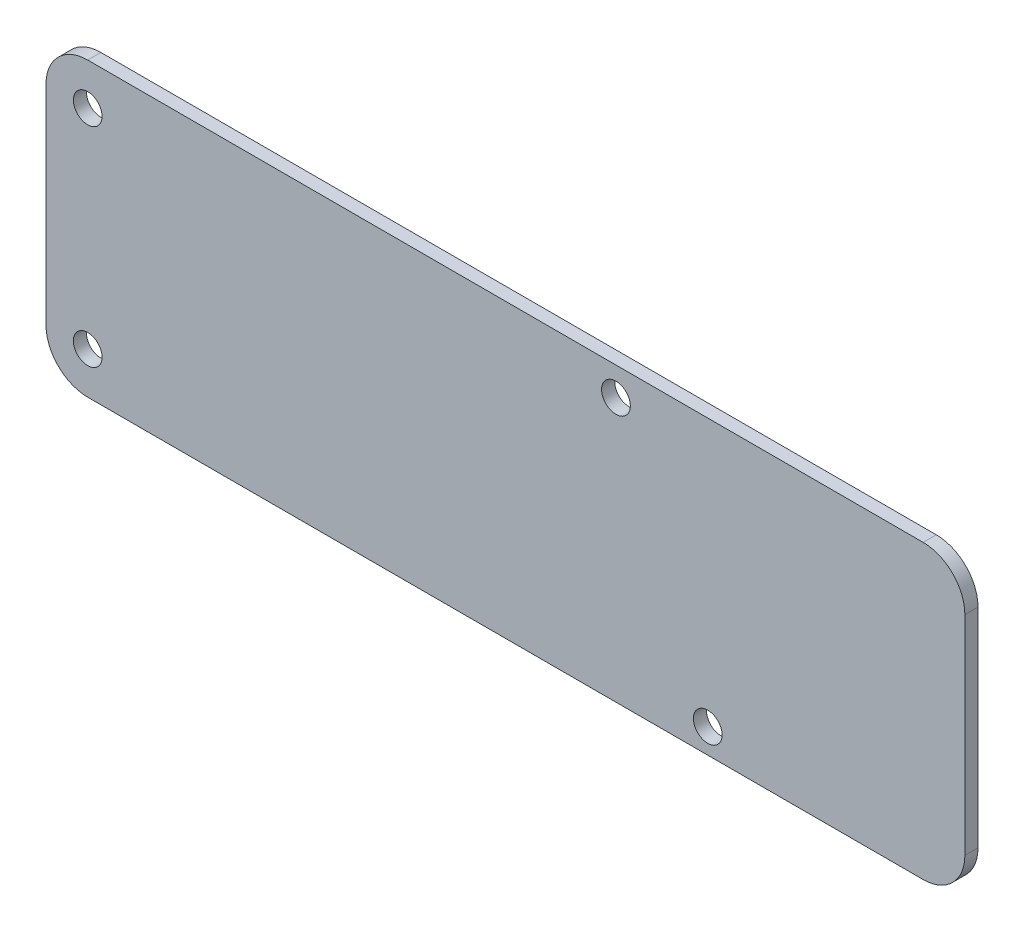
ISO-10303-21;
HEADER;
FILE_DESCRIPTION(('STEP AP214'),'2;1');
FILE_NAME('part.step','',(''),(''),'','','');
FILE_SCHEMA(('AUTOMOTIVE_DESIGN { 1 0 10303 214 1 1 1 1 }'));
ENDSEC;
DATA;
#1=APPLICATION_CONTEXT('core data for automotive mechanical design processes');
#2=APPLICATION_PROTOCOL_DEFINITION('international standard','automotive_design',2000,#1);
#3=PRODUCT_CONTEXT('',#1,'mechanical');
#4=PRODUCT('Part','Part','',(#3));
#5=PRODUCT_RELATED_PRODUCT_CATEGORY('part','',(#4));
#6=PRODUCT_DEFINITION_FORMATION('','',#4);
#7=PRODUCT_DEFINITION_CONTEXT('part definition',#1,'design');
#8=PRODUCT_DEFINITION('design','',#6,#7);
#9=PRODUCT_DEFINITION_SHAPE('','',#8);
#10=(LENGTH_UNIT() NAMED_UNIT(*) SI_UNIT(.MILLI.,.METRE.));
#11=(NAMED_UNIT(*) PLANE_ANGLE_UNIT() SI_UNIT($,.RADIAN.));
#12=(NAMED_UNIT(*) SI_UNIT($,.STERADIAN.) SOLID_ANGLE_UNIT());
#13=UNCERTAINTY_MEASURE_WITH_UNIT(LENGTH_MEASURE(1.E-05),#10,'distance_accuracy_value','');
#14=(GEOMETRIC_REPRESENTATION_CONTEXT(3) GLOBAL_UNCERTAINTY_ASSIGNED_CONTEXT((#13)) GLOBAL_UNIT_ASSIGNED_CONTEXT((#10,
#11,#12)) REPRESENTATION_CONTEXT('',''));
#15=CARTESIAN_POINT('',(0.,0.,0.));
#16=DIRECTION('',(0.,0.,1.));
#17=DIRECTION('',(1.,0.,0.));
#18=AXIS2_PLACEMENT_3D('',#15,#16,#17);
#19=CARTESIAN_POINT('',(0.,-25.4,1.6));
#20=DIRECTION('',(0.,0.,1.));
#21=DIRECTION('',(1.,0.,0.));
#22=AXIS2_PLACEMENT_3D('',#19,#20,#21);
#23=PLANE('',#22);
#24=CARTESIAN_POINT('',(64.33,1.63,1.6));
#25=DIRECTION('',(0.,0.,1.));
#26=DIRECTION('',(1.,0.,0.));
#27=AXIS2_PLACEMENT_3D('',#24,#25,#26);
#28=CIRCLE('',#27,1.75);
#29=CARTESIAN_POINT('',(66.08,1.63,1.6));
#30=VERTEX_POINT('',#29);
#31=EDGE_CURVE('E194',#30,#30,#28,.T.);
#32=ORIENTED_EDGE('',*,*,#31,.F.);
#33=EDGE_LOOP('',(#32));
#34=FACE_BOUND('',#33,.T.);
#35=CARTESIAN_POINT('',(0.,0.,1.6));
#36=DIRECTION('',(0.,0.,1.));
#37=DIRECTION('',(1.,0.,0.));
#38=AXIS2_PLACEMENT_3D('',#35,#36,#37);
#39=CIRCLE('',#38,1.75);
#40=CARTESIAN_POINT('',(1.75,0.,1.6));
#41=VERTEX_POINT('',#40);
#42=EDGE_CURVE('E140',#41,#41,#39,.T.);
#43=ORIENTED_EDGE('',*,*,#42,.F.);
#44=EDGE_LOOP('',(#43));
#45=FACE_BOUND('',#44,.T.);
#46=CARTESIAN_POINT('',(0.,-25.4,1.6));
#47=DIRECTION('',(0.,0.,1.));
#48=DIRECTION('',(1.,0.,0.));
#49=AXIS2_PLACEMENT_3D('',#46,#47,#48);
#50=CIRCLE('',#49,5.08);
#51=CARTESIAN_POINT('',(-5.08,-25.4,1.6));
#52=VERTEX_POINT('',#51);
#53=CARTESIAN_POINT('',(0.,-30.48,1.6));
#54=VERTEX_POINT('',#53);
#55=EDGE_CURVE('E151',#52,#54,#50,.T.);
#56=ORIENTED_EDGE('',*,*,#55,.T.);
#57=DIRECTION('',(1.,0.,0.));
#58=VECTOR('',#57,1.);
#59=CARTESIAN_POINT('',(0.,-30.48,1.6));
#60=LINE('',#59,#58);
#61=CARTESIAN_POINT('',(101.74,-30.48,1.6));
#62=VERTEX_POINT('',#61);
#63=EDGE_CURVE('E99',#54,#62,#60,.T.);
#64=ORIENTED_EDGE('',*,*,#63,.T.);
#65=CARTESIAN_POINT('',(101.74,-25.4,1.6));
#66=DIRECTION('',(0.,0.,1.));
#67=DIRECTION('',(1.,0.,0.));
#68=AXIS2_PLACEMENT_3D('',#65,#66,#67);
#69=CIRCLE('',#68,5.08);
#70=CARTESIAN_POINT('',(106.82,-25.4,1.6));
#71=VERTEX_POINT('',#70);
#72=EDGE_CURVE('E166',#62,#71,#69,.T.);
#73=ORIENTED_EDGE('',*,*,#72,.T.);
#74=DIRECTION('',(0.,1.,0.));
#75=VECTOR('',#74,1.);
#76=CARTESIAN_POINT('',(106.82,0.,1.6));
#77=LINE('',#76,#75);
#78=CARTESIAN_POINT('',(106.82,0.,1.6));
#79=VERTEX_POINT('',#78);
#80=EDGE_CURVE('E179',#71,#79,#77,.T.);
#81=ORIENTED_EDGE('',*,*,#80,.T.);
#82=CARTESIAN_POINT('',(101.74,0.,1.6));
#83=DIRECTION('',(0.,0.,1.));
#84=DIRECTION('',(-1.,0.,0.));
#85=AXIS2_PLACEMENT_3D('',#82,#83,#84);
#86=CIRCLE('',#85,5.08);
#87=CARTESIAN_POINT('',(101.74,5.08,1.6));
#88=VERTEX_POINT('',#87);
#89=EDGE_CURVE('E118',#79,#88,#86,.T.);
#90=ORIENTED_EDGE('',*,*,#89,.T.);
#91=DIRECTION('',(-1.,0.,0.));
#92=VECTOR('',#91,1.);
#93=CARTESIAN_POINT('',(0.,5.08,1.6));
#94=LINE('',#93,#92);
#95=CARTESIAN_POINT('',(0.,5.08,1.6));
#96=VERTEX_POINT('',#95);
#97=EDGE_CURVE('E112',#88,#96,#94,.T.);
#98=ORIENTED_EDGE('',*,*,#97,.T.);
#99=CARTESIAN_POINT('',(0.,0.,1.6));
#100=DIRECTION('',(0.,0.,1.));
#101=DIRECTION('',(1.,0.,0.));
#102=AXIS2_PLACEMENT_3D('',#99,#100,#101);
#103=CIRCLE('',#102,5.08);
#104=CARTESIAN_POINT('',(-5.08,0.,1.6));
#105=VERTEX_POINT('',#104);
#106=EDGE_CURVE('E116',#96,#105,#103,.T.);
#107=ORIENTED_EDGE('',*,*,#106,.T.);
#108=DIRECTION('',(0.,-1.,0.));
#109=VECTOR('',#108,1.);
#110=CARTESIAN_POINT('',(-5.08,0.,1.6));
#111=LINE('',#110,#109);
#112=EDGE_CURVE('E56',#105,#52,#111,.T.);
#113=ORIENTED_EDGE('',*,*,#112,.T.);
#114=EDGE_LOOP('',(#56,#64,#73,#81,#90,#98,#107,#113));
#115=FACE_BOUND('',#114,.T.);
#116=CARTESIAN_POINT('',(0.,-25.4,1.6));
#117=DIRECTION('',(0.,0.,1.));
#118=DIRECTION('',(1.,0.,0.));
#119=AXIS2_PLACEMENT_3D('',#116,#117,#118);
#120=CIRCLE('',#119,1.75);
#121=CARTESIAN_POINT('',(1.75,-25.4,1.6));
#122=VERTEX_POINT('',#121);
#123=EDGE_CURVE('E188',#122,#122,#120,.T.);
#124=ORIENTED_EDGE('',*,*,#123,.F.);
#125=EDGE_LOOP('',(#124));
#126=FACE_BOUND('',#125,.T.);
#127=CARTESIAN_POINT('',(75.51,-27.48,1.6));
#128=DIRECTION('',(0.,0.,1.));
#129=DIRECTION('',(1.,0.,0.));
#130=AXIS2_PLACEMENT_3D('',#127,#128,#129);
#131=CIRCLE('',#130,1.75);
#132=CARTESIAN_POINT('',(77.26,-27.48,1.6));
#133=VERTEX_POINT('',#132);
#134=EDGE_CURVE('E200',#133,#133,#131,.T.);
#135=ORIENTED_EDGE('',*,*,#134,.F.);
#136=EDGE_LOOP('',(#135));
#137=FACE_BOUND('',#136,.T.);
#138=ADVANCED_FACE('F39',(#34,#45,#115,#126,#137),#23,.T.);
#139=CARTESIAN_POINT('',(0.,-25.4,0.));
#140=DIRECTION('',(0.,0.,1.));
#141=DIRECTION('',(1.,0.,0.));
#142=AXIS2_PLACEMENT_3D('',#139,#140,#141);
#143=PLANE('',#142);
#144=CARTESIAN_POINT('',(0.,-25.4,0.));
#145=DIRECTION('',(0.,0.,1.));
#146=DIRECTION('',(1.,0.,0.));
#147=AXIS2_PLACEMENT_3D('',#144,#145,#146);
#148=CIRCLE('',#147,5.08);
#149=CARTESIAN_POINT('',(-5.08,-25.4,0.));
#150=VERTEX_POINT('',#149);
#151=CARTESIAN_POINT('',(0.,-30.48,0.));
#152=VERTEX_POINT('',#151);
#153=EDGE_CURVE('E136',#150,#152,#148,.T.);
#154=ORIENTED_EDGE('',*,*,#153,.F.);
#155=DIRECTION('',(0.,-1.,0.));
#156=VECTOR('',#155,1.);
#157=CARTESIAN_POINT('',(-5.08,0.,0.));
#158=LINE('',#157,#156);
#159=CARTESIAN_POINT('',(-5.08,0.,0.));
#160=VERTEX_POINT('',#159);
#161=EDGE_CURVE('E91',#160,#150,#158,.T.);
#162=ORIENTED_EDGE('',*,*,#161,.F.);
#163=CARTESIAN_POINT('',(0.,0.,0.));
#164=DIRECTION('',(0.,0.,1.));
#165=DIRECTION('',(1.,0.,0.));
#166=AXIS2_PLACEMENT_3D('',#163,#164,#165);
#167=CIRCLE('',#166,5.08);
#168=CARTESIAN_POINT('',(0.,5.08,0.));
#169=VERTEX_POINT('',#168);
#170=EDGE_CURVE('E85',#169,#160,#167,.T.);
#171=ORIENTED_EDGE('',*,*,#170,.F.);
#172=DIRECTION('',(-1.,0.,0.));
#173=VECTOR('',#172,1.);
#174=CARTESIAN_POINT('',(0.,5.08,0.));
#175=LINE('',#174,#173);
#176=CARTESIAN_POINT('',(101.74,5.08,0.));
#177=VERTEX_POINT('',#176);
#178=EDGE_CURVE('E126',#177,#169,#175,.T.);
#179=ORIENTED_EDGE('',*,*,#178,.F.);
#180=CARTESIAN_POINT('',(101.74,0.,0.));
#181=DIRECTION('',(0.,0.,1.));
#182=DIRECTION('',(-1.,0.,0.));
#183=AXIS2_PLACEMENT_3D('',#180,#181,#182);
#184=CIRCLE('',#183,5.08);
#185=CARTESIAN_POINT('',(106.82,0.,0.));
#186=VERTEX_POINT('',#185);
#187=EDGE_CURVE('E146',#186,#177,#184,.T.);
#188=ORIENTED_EDGE('',*,*,#187,.F.);
#189=DIRECTION('',(0.,1.,0.));
#190=VECTOR('',#189,1.);
#191=CARTESIAN_POINT('',(106.82,0.,0.));
#192=LINE('',#191,#190);
#193=CARTESIAN_POINT('',(106.82,-25.4,0.));
#194=VERTEX_POINT('',#193);
#195=EDGE_CURVE('E144',#194,#186,#192,.T.);
#196=ORIENTED_EDGE('',*,*,#195,.F.);
#197=CARTESIAN_POINT('',(101.74,-25.4,0.));
#198=DIRECTION('',(0.,0.,1.));
#199=DIRECTION('',(1.,0.,0.));
#200=AXIS2_PLACEMENT_3D('',#197,#198,#199);
#201=CIRCLE('',#200,5.08);
#202=CARTESIAN_POINT('',(101.74,-30.48,0.));
#203=VERTEX_POINT('',#202);
#204=EDGE_CURVE('E142',#203,#194,#201,.T.);
#205=ORIENTED_EDGE('',*,*,#204,.F.);
#206=DIRECTION('',(1.,0.,0.));
#207=VECTOR('',#206,1.);
#208=CARTESIAN_POINT('',(0.,-30.48,0.));
#209=LINE('',#208,#207);
#210=EDGE_CURVE('E139',#152,#203,#209,.T.);
#211=ORIENTED_EDGE('',*,*,#210,.F.);
#212=EDGE_LOOP('',(#154,#162,#171,#179,#188,#196,#205,#211));
#213=FACE_BOUND('',#212,.T.);
#214=CARTESIAN_POINT('',(0.,0.,0.));
#215=DIRECTION('',(0.,0.,1.));
#216=DIRECTION('',(1.,0.,0.));
#217=AXIS2_PLACEMENT_3D('',#214,#215,#216);
#218=CIRCLE('',#217,1.75);
#219=CARTESIAN_POINT('',(1.75,0.,0.));
#220=VERTEX_POINT('',#219);
#221=EDGE_CURVE('E185',#220,#220,#218,.T.);
#222=ORIENTED_EDGE('',*,*,#221,.T.);
#223=EDGE_LOOP('',(#222));
#224=FACE_BOUND('',#223,.T.);
#225=CARTESIAN_POINT('',(0.,-25.4,0.));
#226=DIRECTION('',(0.,0.,1.));
#227=DIRECTION('',(1.,0.,0.));
#228=AXIS2_PLACEMENT_3D('',#225,#226,#227);
#229=CIRCLE('',#228,1.75);
#230=CARTESIAN_POINT('',(1.75,-25.4,0.));
#231=VERTEX_POINT('',#230);
#232=EDGE_CURVE('E191',#231,#231,#229,.T.);
#233=ORIENTED_EDGE('',*,*,#232,.T.);
#234=EDGE_LOOP('',(#233));
#235=FACE_BOUND('',#234,.T.);
#236=CARTESIAN_POINT('',(64.33,1.63,0.));
#237=DIRECTION('',(0.,0.,1.));
#238=DIRECTION('',(1.,0.,0.));
#239=AXIS2_PLACEMENT_3D('',#236,#237,#238);
#240=CIRCLE('',#239,1.75);
#241=CARTESIAN_POINT('',(66.08,1.63,0.));
#242=VERTEX_POINT('',#241);
#243=EDGE_CURVE('E197',#242,#242,#240,.T.);
#244=ORIENTED_EDGE('',*,*,#243,.T.);
#245=EDGE_LOOP('',(#244));
#246=FACE_BOUND('',#245,.T.);
#247=CARTESIAN_POINT('',(75.51,-27.48,0.));
#248=DIRECTION('',(0.,0.,1.));
#249=DIRECTION('',(1.,0.,0.));
#250=AXIS2_PLACEMENT_3D('',#247,#248,#249);
#251=CIRCLE('',#250,1.75);
#252=CARTESIAN_POINT('',(77.26,-27.48,0.));
#253=VERTEX_POINT('',#252);
#254=EDGE_CURVE('E203',#253,#253,#251,.T.);
#255=ORIENTED_EDGE('',*,*,#254,.T.);
#256=EDGE_LOOP('',(#255));
#257=FACE_BOUND('',#256,.T.);
#258=ADVANCED_FACE('F170',(#213,#224,#235,#246,#257),#143,.F.);
#259=CARTESIAN_POINT('',(0.,-25.4,1.6));
#260=DIRECTION('',(0.,0.,-1.));
#261=DIRECTION('',(-1.,0.,0.));
#262=AXIS2_PLACEMENT_3D('',#259,#260,#261);
#263=CYLINDRICAL_SURFACE('',#262,5.08);
#264=ORIENTED_EDGE('',*,*,#153,.T.);
#265=DIRECTION('',(0.,0.,-1.));
#266=VECTOR('',#265,1.);
#267=CARTESIAN_POINT('',(0.,-30.48,1.6));
#268=LINE('',#267,#266);
#269=EDGE_CURVE('E11',#54,#152,#268,.T.);
#270=ORIENTED_EDGE('',*,*,#269,.F.);
#271=ORIENTED_EDGE('',*,*,#55,.F.);
#272=DIRECTION('',(0.,0.,-1.));
#273=VECTOR('',#272,1.);
#274=CARTESIAN_POINT('',(-5.08,-25.4,1.6));
#275=LINE('',#274,#273);
#276=EDGE_CURVE('E132',#52,#150,#275,.T.);
#277=ORIENTED_EDGE('',*,*,#276,.T.);
#278=EDGE_LOOP('',(#264,#270,#271,#277));
#279=FACE_BOUND('',#278,.T.);
#280=ADVANCED_FACE('F41',(#279),#263,.T.);
#281=CARTESIAN_POINT('',(0.,-30.48,1.6));
#282=DIRECTION('',(0.,1.,0.));
#283=DIRECTION('',(0.,0.,1.));
#284=AXIS2_PLACEMENT_3D('',#281,#282,#283);
#285=PLANE('',#284);
#286=ORIENTED_EDGE('',*,*,#210,.T.);
#287=DIRECTION('',(0.,0.,-1.));
#288=VECTOR('',#287,1.);
#289=CARTESIAN_POINT('',(101.74,-30.48,1.6));
#290=LINE('',#289,#288);
#291=EDGE_CURVE('E48',#62,#203,#290,.T.);
#292=ORIENTED_EDGE('',*,*,#291,.F.);
#293=ORIENTED_EDGE('',*,*,#63,.F.);
#294=ORIENTED_EDGE('',*,*,#269,.T.);
#295=EDGE_LOOP('',(#286,#292,#293,#294));
#296=FACE_BOUND('',#295,.T.);
#297=ADVANCED_FACE('F237',(#296),#285,.F.);
#298=CARTESIAN_POINT('',(101.74,-25.4,1.6));
#299=DIRECTION('',(0.,0.,-1.));
#300=DIRECTION('',(-1.,0.,0.));
#301=AXIS2_PLACEMENT_3D('',#298,#299,#300);
#302=CYLINDRICAL_SURFACE('',#301,5.08);
#303=ORIENTED_EDGE('',*,*,#204,.T.);
#304=DIRECTION('',(0.,0.,-1.));
#305=VECTOR('',#304,1.);
#306=CARTESIAN_POINT('',(106.82,-25.4,1.6));
#307=LINE('',#306,#305);
#308=EDGE_CURVE('E158',#71,#194,#307,.T.);
#309=ORIENTED_EDGE('',*,*,#308,.F.);
#310=ORIENTED_EDGE('',*,*,#72,.F.);
#311=ORIENTED_EDGE('',*,*,#291,.T.);
#312=EDGE_LOOP('',(#303,#309,#310,#311));
#313=FACE_BOUND('',#312,.T.);
#314=ADVANCED_FACE('F164',(#313),#302,.T.);
#315=CARTESIAN_POINT('',(106.82,0.,1.6));
#316=DIRECTION('',(-1.,0.,0.));
#317=DIRECTION('',(0.,0.,1.));
#318=AXIS2_PLACEMENT_3D('',#315,#316,#317);
#319=PLANE('',#318);
#320=ORIENTED_EDGE('',*,*,#195,.T.);
#321=DIRECTION('',(0.,0.,-1.));
#322=VECTOR('',#321,1.);
#323=CARTESIAN_POINT('',(106.82,0.,1.6));
#324=LINE('',#323,#322);
#325=EDGE_CURVE('E155',#79,#186,#324,.T.);
#326=ORIENTED_EDGE('',*,*,#325,.F.);
#327=ORIENTED_EDGE('',*,*,#80,.F.);
#328=ORIENTED_EDGE('',*,*,#308,.T.);
#329=EDGE_LOOP('',(#320,#326,#327,#328));
#330=FACE_BOUND('',#329,.T.);
#331=ADVANCED_FACE('F175',(#330),#319,.F.);
#332=CARTESIAN_POINT('',(101.74,0.,1.6));
#333=DIRECTION('',(0.,0.,-1.));
#334=DIRECTION('',(-1.,0.,0.));
#335=AXIS2_PLACEMENT_3D('',#332,#333,#334);
#336=CYLINDRICAL_SURFACE('',#335,5.08);
#337=ORIENTED_EDGE('',*,*,#187,.T.);
#338=DIRECTION('',(0.,0.,-1.));
#339=VECTOR('',#338,1.);
#340=CARTESIAN_POINT('',(101.74,5.08,1.6));
#341=LINE('',#340,#339);
#342=EDGE_CURVE('E127',#88,#177,#341,.T.);
#343=ORIENTED_EDGE('',*,*,#342,.F.);
#344=ORIENTED_EDGE('',*,*,#89,.F.);
#345=ORIENTED_EDGE('',*,*,#325,.T.);
#346=EDGE_LOOP('',(#337,#343,#344,#345));
#347=FACE_BOUND('',#346,.T.);
#348=ADVANCED_FACE('F178',(#347),#336,.T.);
#349=CARTESIAN_POINT('',(0.,5.08,1.6));
#350=DIRECTION('',(0.,-1.,0.));
#351=DIRECTION('',(0.,0.,-1.));
#352=AXIS2_PLACEMENT_3D('',#349,#350,#351);
#353=PLANE('',#352);
#354=ORIENTED_EDGE('',*,*,#178,.T.);
#355=DIRECTION('',(0.,0.,-1.));
#356=VECTOR('',#355,1.);
#357=CARTESIAN_POINT('',(0.,5.08,1.6));
#358=LINE('',#357,#356);
#359=EDGE_CURVE('E123',#96,#169,#358,.T.);
#360=ORIENTED_EDGE('',*,*,#359,.F.);
#361=ORIENTED_EDGE('',*,*,#97,.F.);
#362=ORIENTED_EDGE('',*,*,#342,.T.);
#363=EDGE_LOOP('',(#354,#360,#361,#362));
#364=FACE_BOUND('',#363,.T.);
#365=ADVANCED_FACE('F124',(#364),#353,.F.);
#366=CARTESIAN_POINT('',(0.,0.,1.6));
#367=DIRECTION('',(0.,0.,-1.));
#368=DIRECTION('',(-1.,0.,0.));
#369=AXIS2_PLACEMENT_3D('',#366,#367,#368);
#370=CYLINDRICAL_SURFACE('',#369,5.08);
#371=ORIENTED_EDGE('',*,*,#170,.T.);
#372=DIRECTION('',(0.,0.,-1.));
#373=VECTOR('',#372,1.);
#374=CARTESIAN_POINT('',(-5.08,0.,1.6));
#375=LINE('',#374,#373);
#376=EDGE_CURVE('E128',#105,#160,#375,.T.);
#377=ORIENTED_EDGE('',*,*,#376,.F.);
#378=ORIENTED_EDGE('',*,*,#106,.F.);
#379=ORIENTED_EDGE('',*,*,#359,.T.);
#380=EDGE_LOOP('',(#371,#377,#378,#379));
#381=FACE_BOUND('',#380,.T.);
#382=ADVANCED_FACE('F130',(#381),#370,.T.);
#383=CARTESIAN_POINT('',(-5.08,0.,1.6));
#384=DIRECTION('',(1.,0.,0.));
#385=DIRECTION('',(0.,1.,0.));
#386=AXIS2_PLACEMENT_3D('',#383,#384,#385);
#387=PLANE('',#386);
#388=ORIENTED_EDGE('',*,*,#161,.T.);
#389=ORIENTED_EDGE('',*,*,#276,.F.);
#390=ORIENTED_EDGE('',*,*,#112,.F.);
#391=ORIENTED_EDGE('',*,*,#376,.T.);
#392=EDGE_LOOP('',(#388,#389,#390,#391));
#393=FACE_BOUND('',#392,.T.);
#394=ADVANCED_FACE('F225',(#393),#387,.F.);
#395=CARTESIAN_POINT('',(0.,0.,1.6));
#396=DIRECTION('',(0.,0.,-1.));
#397=DIRECTION('',(-1.,0.,0.));
#398=AXIS2_PLACEMENT_3D('',#395,#396,#397);
#399=CYLINDRICAL_SURFACE('',#398,1.75);
#400=ORIENTED_EDGE('',*,*,#42,.T.);
#401=EDGE_LOOP('',(#400));
#402=FACE_BOUND('',#401,.T.);
#403=ORIENTED_EDGE('',*,*,#221,.F.);
#404=EDGE_LOOP('',(#403));
#405=FACE_BOUND('',#404,.T.);
#406=ADVANCED_FACE('F222',(#402,#405),#399,.F.);
#407=CARTESIAN_POINT('',(0.,-25.4,1.6));
#408=DIRECTION('',(0.,0.,-1.));
#409=DIRECTION('',(-1.,0.,0.));
#410=AXIS2_PLACEMENT_3D('',#407,#408,#409);
#411=CYLINDRICAL_SURFACE('',#410,1.75);
#412=ORIENTED_EDGE('',*,*,#123,.T.);
#413=EDGE_LOOP('',(#412));
#414=FACE_BOUND('',#413,.T.);
#415=ORIENTED_EDGE('',*,*,#232,.F.);
#416=EDGE_LOOP('',(#415));
#417=FACE_BOUND('',#416,.T.);
#418=ADVANCED_FACE('F300',(#414,#417),#411,.F.);
#419=CARTESIAN_POINT('',(64.33,1.63,1.6));
#420=DIRECTION('',(0.,0.,-1.));
#421=DIRECTION('',(-1.,0.,0.));
#422=AXIS2_PLACEMENT_3D('',#419,#420,#421);
#423=CYLINDRICAL_SURFACE('',#422,1.75);
#424=ORIENTED_EDGE('',*,*,#31,.T.);
#425=EDGE_LOOP('',(#424));
#426=FACE_BOUND('',#425,.T.);
#427=ORIENTED_EDGE('',*,*,#243,.F.);
#428=EDGE_LOOP('',(#427));
#429=FACE_BOUND('',#428,.T.);
#430=ADVANCED_FACE('F308',(#426,#429),#423,.F.);
#431=CARTESIAN_POINT('',(75.51,-27.48,1.6));
#432=DIRECTION('',(0.,0.,-1.));
#433=DIRECTION('',(-1.,0.,0.));
#434=AXIS2_PLACEMENT_3D('',#431,#432,#433);
#435=CYLINDRICAL_SURFACE('',#434,1.75);
#436=ORIENTED_EDGE('',*,*,#134,.T.);
#437=EDGE_LOOP('',(#436));
#438=FACE_BOUND('',#437,.T.);
#439=ORIENTED_EDGE('',*,*,#254,.F.);
#440=EDGE_LOOP('',(#439));
#441=FACE_BOUND('',#440,.T.);
#442=ADVANCED_FACE('F209',(#438,#441),#435,.F.);
#443=CLOSED_SHELL('',(#138,#258,#280,#297,#314,#331,#348,#365,#382,#394,#406,#418,#430,#442));
#444=MANIFOLD_SOLID_BREP('B2',#443);
#445=ADVANCED_BREP_SHAPE_REPRESENTATION('',(#18,#444),#14);
#446=SHAPE_DEFINITION_REPRESENTATION(#9,#445);
ENDSEC;
END-ISO-10303-21;
